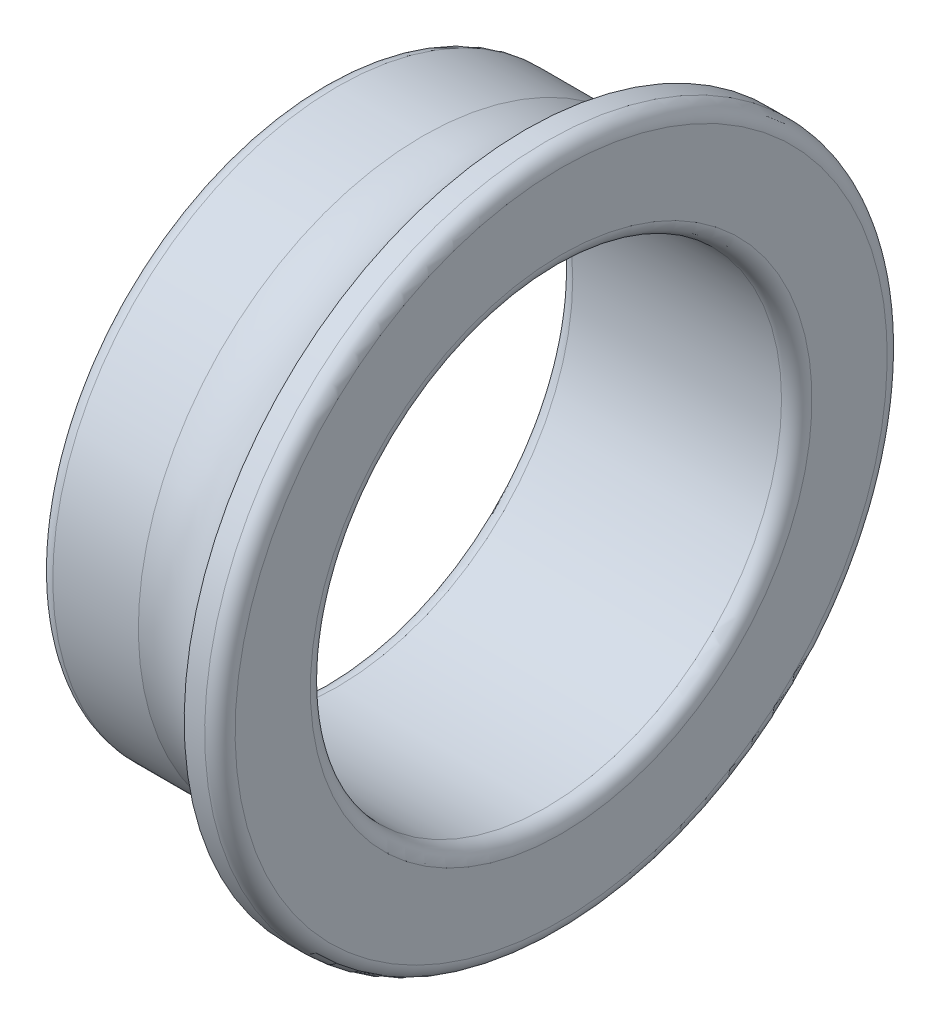
ISO-10303-21;
HEADER;
FILE_DESCRIPTION(('STEP AP214'),'2;1');
FILE_NAME('part.step','',(''),(''),'','','');
FILE_SCHEMA(('AUTOMOTIVE_DESIGN { 1 0 10303 214 1 1 1 1 }'));
ENDSEC;
DATA;
#1=APPLICATION_CONTEXT('core data for automotive mechanical design processes');
#2=APPLICATION_PROTOCOL_DEFINITION('international standard','automotive_design',2000,#1);
#3=PRODUCT_CONTEXT('',#1,'mechanical');
#4=PRODUCT('Part','Part','',(#3));
#5=PRODUCT_RELATED_PRODUCT_CATEGORY('part','',(#4));
#6=PRODUCT_DEFINITION_FORMATION('','',#4);
#7=PRODUCT_DEFINITION_CONTEXT('part definition',#1,'design');
#8=PRODUCT_DEFINITION('design','',#6,#7);
#9=PRODUCT_DEFINITION_SHAPE('','',#8);
#10=(LENGTH_UNIT() NAMED_UNIT(*) SI_UNIT(.MILLI.,.METRE.));
#11=(NAMED_UNIT(*) PLANE_ANGLE_UNIT() SI_UNIT($,.RADIAN.));
#12=(NAMED_UNIT(*) SI_UNIT($,.STERADIAN.) SOLID_ANGLE_UNIT());
#13=UNCERTAINTY_MEASURE_WITH_UNIT(LENGTH_MEASURE(1.E-05),#10,'distance_accuracy_value','');
#14=(GEOMETRIC_REPRESENTATION_CONTEXT(3) GLOBAL_UNCERTAINTY_ASSIGNED_CONTEXT((#13)) GLOBAL_UNIT_ASSIGNED_CONTEXT((#10,
#11,#12)) REPRESENTATION_CONTEXT('',''));
#15=CARTESIAN_POINT('',(0.,0.,0.));
#16=DIRECTION('',(0.,0.,1.));
#17=DIRECTION('',(1.,0.,0.));
#18=AXIS2_PLACEMENT_3D('',#15,#16,#17);
#19=CARTESIAN_POINT('',(30.9,0.,0.));
#20=DIRECTION('',(1.,0.,0.));
#21=DIRECTION('',(0.,0.,-1.));
#22=AXIS2_PLACEMENT_3D('',#19,#20,#21);
#23=TOROIDAL_SURFACE('',#22,34.6,2.1);
#24=CARTESIAN_POINT('',(33.,0.,0.));
#25=DIRECTION('',(1.,0.,0.));
#26=DIRECTION('',(0.,1.,0.));
#27=AXIS2_PLACEMENT_3D('',#24,#25,#26);
#28=CIRCLE('',#27,34.6);
#29=CARTESIAN_POINT('',(33.,34.6,0.));
#30=VERTEX_POINT('',#29);
#31=EDGE_CURVE('E11',#30,#30,#28,.T.);
#32=ORIENTED_EDGE('',*,*,#31,.T.);
#33=EDGE_LOOP('',(#32));
#34=FACE_BOUND('',#33,.T.);
#35=CARTESIAN_POINT('',(30.9,0.,0.));
#36=DIRECTION('',(1.,0.,0.));
#37=DIRECTION('',(0.,1.,0.));
#38=AXIS2_PLACEMENT_3D('',#35,#36,#37);
#39=CIRCLE('',#38,32.5);
#40=CARTESIAN_POINT('',(30.9,32.5,0.));
#41=VERTEX_POINT('',#40);
#42=EDGE_CURVE('E67',#41,#41,#39,.T.);
#43=ORIENTED_EDGE('',*,*,#42,.F.);
#44=EDGE_LOOP('',(#43));
#45=FACE_BOUND('',#44,.T.);
#46=ADVANCED_FACE('F19',(#34,#45),#23,.T.);
#47=CARTESIAN_POINT('',(33.,39.7875,0.));
#48=DIRECTION('',(1.,0.,0.));
#49=DIRECTION('',(0.,1.,0.));
#50=AXIS2_PLACEMENT_3D('',#47,#48,#49);
#51=PLANE('',#50);
#52=CARTESIAN_POINT('',(33.,0.,0.));
#53=DIRECTION('',(1.,0.,0.));
#54=DIRECTION('',(0.,1.,0.));
#55=AXIS2_PLACEMENT_3D('',#52,#53,#54);
#56=CIRCLE('',#55,44.975);
#57=CARTESIAN_POINT('',(33.,44.975,0.));
#58=VERTEX_POINT('',#57);
#59=EDGE_CURVE('E29',#58,#58,#56,.T.);
#60=ORIENTED_EDGE('',*,*,#59,.T.);
#61=EDGE_LOOP('',(#60));
#62=FACE_BOUND('',#61,.T.);
#63=ORIENTED_EDGE('',*,*,#31,.F.);
#64=EDGE_LOOP('',(#63));
#65=FACE_BOUND('',#64,.T.);
#66=ADVANCED_FACE('F101',(#62,#65),#51,.T.);
#67=CARTESIAN_POINT('',(30.9,0.,0.));
#68=DIRECTION('',(1.,0.,0.));
#69=DIRECTION('',(0.,0.,-1.));
#70=AXIS2_PLACEMENT_3D('',#67,#68,#69);
#71=TOROIDAL_SURFACE('',#70,44.975,2.1);
#72=CARTESIAN_POINT('',(30.9,0.,0.));
#73=DIRECTION('',(1.,0.,0.));
#74=DIRECTION('',(0.,1.,0.));
#75=AXIS2_PLACEMENT_3D('',#72,#73,#74);
#76=CIRCLE('',#75,47.075);
#77=CARTESIAN_POINT('',(30.9,47.075,0.));
#78=VERTEX_POINT('',#77);
#79=EDGE_CURVE('E80',#78,#78,#76,.T.);
#80=ORIENTED_EDGE('',*,*,#79,.T.);
#81=EDGE_LOOP('',(#80));
#82=FACE_BOUND('',#81,.T.);
#83=ORIENTED_EDGE('',*,*,#59,.F.);
#84=EDGE_LOOP('',(#83));
#85=FACE_BOUND('',#84,.T.);
#86=ADVANCED_FACE('F87',(#82,#85),#71,.T.);
#87=CARTESIAN_POINT('',(29.4864752656518,0.,0.));
#88=DIRECTION('',(-1.,0.,0.));
#89=DIRECTION('',(0.,1.,0.));
#90=AXIS2_PLACEMENT_3D('',#87,#88,#89);
#91=CYLINDRICAL_SURFACE('',#90,47.075);
#92=CARTESIAN_POINT('',(28.0729505313036,0.,0.));
#93=DIRECTION('',(1.,0.,0.));
#94=DIRECTION('',(0.,1.,0.));
#95=AXIS2_PLACEMENT_3D('',#92,#93,#94);
#96=CIRCLE('',#95,47.075);
#97=CARTESIAN_POINT('',(28.0729505313036,47.075,0.));
#98=VERTEX_POINT('',#97);
#99=EDGE_CURVE('E59',#98,#98,#96,.T.);
#100=ORIENTED_EDGE('',*,*,#99,.T.);
#101=EDGE_LOOP('',(#100));
#102=FACE_BOUND('',#101,.T.);
#103=ORIENTED_EDGE('',*,*,#79,.F.);
#104=EDGE_LOOP('',(#103));
#105=FACE_BOUND('',#104,.T.);
#106=ADVANCED_FACE('F90',(#102,#105),#91,.T.);
#107=CARTESIAN_POINT('',(16.5,0.,0.));
#108=DIRECTION('',(1.,0.,0.));
#109=DIRECTION('',(0.,0.,-1.));
#110=AXIS2_PLACEMENT_3D('',#107,#108,#109);
#111=TOROIDAL_SURFACE('',#110,51.25,12.303);
#112=CARTESIAN_POINT('',(13.8993877643908,0.,0.));
#113=DIRECTION('',(1.,0.,0.));
#114=DIRECTION('',(0.,1.,0.));
#115=AXIS2_PLACEMENT_3D('',#112,#113,#114);
#116=CIRCLE('',#115,39.225);
#117=CARTESIAN_POINT('',(13.8993877643908,39.225,0.));
#118=VERTEX_POINT('',#117);
#119=EDGE_CURVE('E54',#118,#118,#116,.T.);
#120=ORIENTED_EDGE('',*,*,#119,.T.);
#121=EDGE_LOOP('',(#120));
#122=FACE_BOUND('',#121,.T.);
#123=ORIENTED_EDGE('',*,*,#99,.F.);
#124=EDGE_LOOP('',(#123));
#125=FACE_BOUND('',#124,.T.);
#126=ADVANCED_FACE('F92',(#122,#125),#111,.F.);
#127=CARTESIAN_POINT('',(7.99969388219543,0.,0.));
#128=DIRECTION('',(-1.,0.,0.));
#129=DIRECTION('',(0.,1.,0.));
#130=AXIS2_PLACEMENT_3D('',#127,#128,#129);
#131=CYLINDRICAL_SURFACE('',#130,39.225);
#132=CARTESIAN_POINT('',(2.1,0.,0.));
#133=DIRECTION('',(1.,0.,0.));
#134=DIRECTION('',(0.,1.,0.));
#135=AXIS2_PLACEMENT_3D('',#132,#133,#134);
#136=CIRCLE('',#135,39.225);
#137=CARTESIAN_POINT('',(2.1,39.225,0.));
#138=VERTEX_POINT('',#137);
#139=EDGE_CURVE('E50',#138,#138,#136,.T.);
#140=ORIENTED_EDGE('',*,*,#139,.T.);
#141=EDGE_LOOP('',(#140));
#142=FACE_BOUND('',#141,.T.);
#143=ORIENTED_EDGE('',*,*,#119,.F.);
#144=EDGE_LOOP('',(#143));
#145=FACE_BOUND('',#144,.T.);
#146=ADVANCED_FACE('F99',(#142,#145),#131,.T.);
#147=CARTESIAN_POINT('',(2.1,0.,0.));
#148=DIRECTION('',(1.,0.,0.));
#149=DIRECTION('',(0.,0.,-1.));
#150=AXIS2_PLACEMENT_3D('',#147,#148,#149);
#151=TOROIDAL_SURFACE('',#150,37.125,2.1);
#152=CARTESIAN_POINT('',(0.,0.,0.));
#153=DIRECTION('',(1.,0.,0.));
#154=DIRECTION('',(0.,1.,0.));
#155=AXIS2_PLACEMENT_3D('',#152,#153,#154);
#156=CIRCLE('',#155,37.125);
#157=CARTESIAN_POINT('',(0.,37.125,0.));
#158=VERTEX_POINT('',#157);
#159=EDGE_CURVE('E82',#158,#158,#156,.T.);
#160=ORIENTED_EDGE('',*,*,#159,.T.);
#161=EDGE_LOOP('',(#160));
#162=FACE_BOUND('',#161,.T.);
#163=ORIENTED_EDGE('',*,*,#139,.F.);
#164=EDGE_LOOP('',(#163));
#165=FACE_BOUND('',#164,.T.);
#166=ADVANCED_FACE('F112',(#162,#165),#151,.T.);
#167=CARTESIAN_POINT('',(0.,35.8625,0.));
#168=DIRECTION('',(-1.,0.,0.));
#169=DIRECTION('',(0.,-1.,0.));
#170=AXIS2_PLACEMENT_3D('',#167,#168,#169);
#171=PLANE('',#170);
#172=CARTESIAN_POINT('',(0.,0.,0.));
#173=DIRECTION('',(1.,0.,0.));
#174=DIRECTION('',(0.,1.,0.));
#175=AXIS2_PLACEMENT_3D('',#172,#173,#174);
#176=CIRCLE('',#175,34.6);
#177=CARTESIAN_POINT('',(0.,34.6,0.));
#178=VERTEX_POINT('',#177);
#179=EDGE_CURVE('E23',#178,#178,#176,.T.);
#180=ORIENTED_EDGE('',*,*,#179,.T.);
#181=EDGE_LOOP('',(#180));
#182=FACE_BOUND('',#181,.T.);
#183=ORIENTED_EDGE('',*,*,#159,.F.);
#184=EDGE_LOOP('',(#183));
#185=FACE_BOUND('',#184,.T.);
#186=ADVANCED_FACE('F21',(#182,#185),#171,.T.);
#187=CARTESIAN_POINT('',(2.1,0.,0.));
#188=DIRECTION('',(1.,0.,0.));
#189=DIRECTION('',(0.,0.,-1.));
#190=AXIS2_PLACEMENT_3D('',#187,#188,#189);
#191=TOROIDAL_SURFACE('',#190,34.6,2.1);
#192=CARTESIAN_POINT('',(2.1,0.,0.));
#193=DIRECTION('',(1.,0.,0.));
#194=DIRECTION('',(0.,1.,0.));
#195=AXIS2_PLACEMENT_3D('',#192,#193,#194);
#196=CIRCLE('',#195,32.5);
#197=CARTESIAN_POINT('',(2.1,32.5,0.));
#198=VERTEX_POINT('',#197);
#199=EDGE_CURVE('E72',#198,#198,#196,.T.);
#200=ORIENTED_EDGE('',*,*,#199,.T.);
#201=EDGE_LOOP('',(#200));
#202=FACE_BOUND('',#201,.T.);
#203=ORIENTED_EDGE('',*,*,#179,.F.);
#204=EDGE_LOOP('',(#203));
#205=FACE_BOUND('',#204,.T.);
#206=ADVANCED_FACE('F73',(#202,#205),#191,.T.);
#207=CARTESIAN_POINT('',(16.5,0.,0.));
#208=DIRECTION('',(-1.,0.,0.));
#209=DIRECTION('',(0.,1.,0.));
#210=AXIS2_PLACEMENT_3D('',#207,#208,#209);
#211=CYLINDRICAL_SURFACE('',#210,32.5);
#212=ORIENTED_EDGE('',*,*,#42,.T.);
#213=EDGE_LOOP('',(#212));
#214=FACE_BOUND('',#213,.T.);
#215=ORIENTED_EDGE('',*,*,#199,.F.);
#216=EDGE_LOOP('',(#215));
#217=FACE_BOUND('',#216,.T.);
#218=ADVANCED_FACE('F116',(#214,#217),#211,.F.);
#219=CLOSED_SHELL('',(#46,#66,#86,#106,#126,#146,#166,#186,#206,#218));
#220=MANIFOLD_SOLID_BREP('B1',#219);
#221=ADVANCED_BREP_SHAPE_REPRESENTATION('',(#18,#220),#14);
#222=SHAPE_DEFINITION_REPRESENTATION(#9,#221);
ENDSEC;
END-ISO-10303-21;
